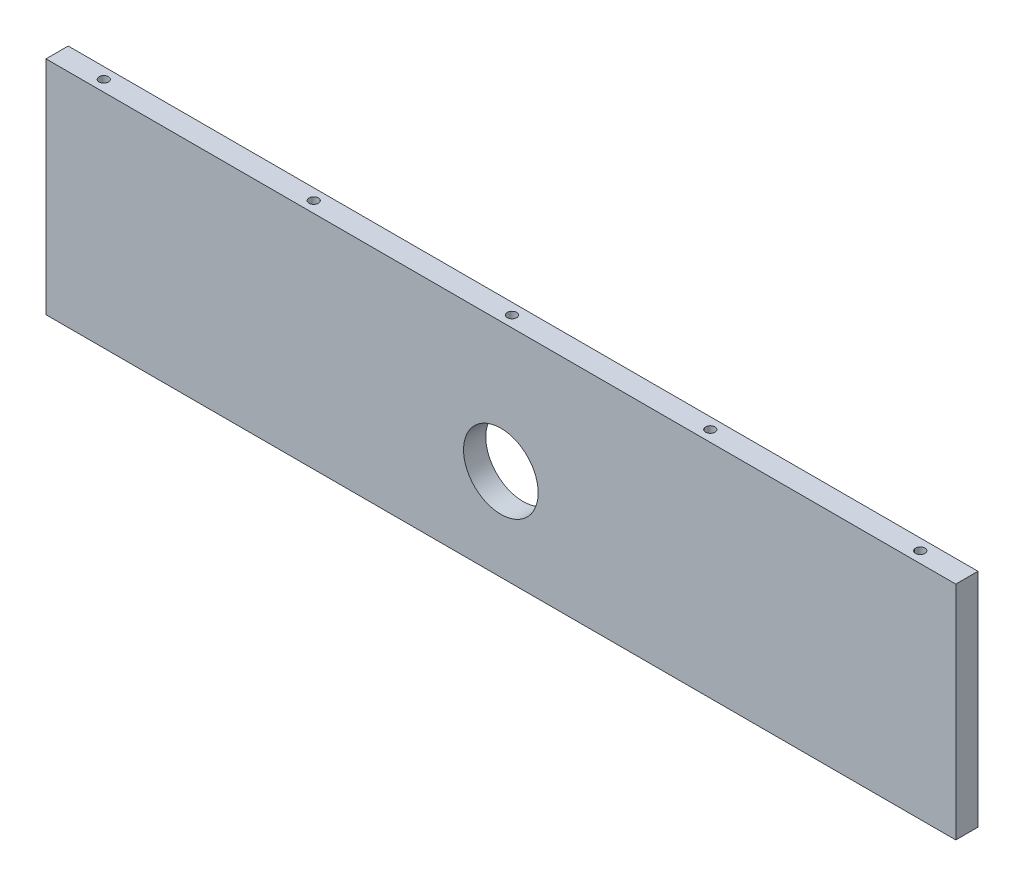
ISO-10303-21;
HEADER;
FILE_DESCRIPTION(('STEP AP214'),'2;1');
FILE_NAME('part.step','',(''),(''),'','','');
FILE_SCHEMA(('AUTOMOTIVE_DESIGN { 1 0 10303 214 1 1 1 1 }'));
ENDSEC;
DATA;
#1=APPLICATION_CONTEXT('core data for automotive mechanical design processes');
#2=APPLICATION_PROTOCOL_DEFINITION('international standard','automotive_design',2000,#1);
#3=PRODUCT_CONTEXT('',#1,'mechanical');
#4=PRODUCT('Part','Part','',(#3));
#5=PRODUCT_RELATED_PRODUCT_CATEGORY('part','',(#4));
#6=PRODUCT_DEFINITION_FORMATION('','',#4);
#7=PRODUCT_DEFINITION_CONTEXT('part definition',#1,'design');
#8=PRODUCT_DEFINITION('design','',#6,#7);
#9=PRODUCT_DEFINITION_SHAPE('','',#8);
#10=(LENGTH_UNIT() NAMED_UNIT(*) SI_UNIT(.MILLI.,.METRE.));
#11=(NAMED_UNIT(*) PLANE_ANGLE_UNIT() SI_UNIT($,.RADIAN.));
#12=(NAMED_UNIT(*) SI_UNIT($,.STERADIAN.) SOLID_ANGLE_UNIT());
#13=UNCERTAINTY_MEASURE_WITH_UNIT(LENGTH_MEASURE(1.E-05),#10,'distance_accuracy_value','');
#14=(GEOMETRIC_REPRESENTATION_CONTEXT(3) GLOBAL_UNCERTAINTY_ASSIGNED_CONTEXT((#13)) GLOBAL_UNIT_ASSIGNED_CONTEXT((#10,
#11,#12)) REPRESENTATION_CONTEXT('',''));
#15=CARTESIAN_POINT('',(0.,0.,0.));
#16=DIRECTION('',(0.,0.,1.));
#17=DIRECTION('',(1.,0.,0.));
#18=AXIS2_PLACEMENT_3D('',#15,#16,#17);
#19=CARTESIAN_POINT('',(-195.,47.5,9.525));
#20=DIRECTION('',(1.,0.,0.));
#21=DIRECTION('',(0.,0.,-1.));
#22=AXIS2_PLACEMENT_3D('',#19,#20,#21);
#23=PLANE('',#22);
#24=DIRECTION('',(0.,-1.,0.));
#25=VECTOR('',#24,1.);
#26=CARTESIAN_POINT('',(-195.,47.5,0.));
#27=LINE('',#26,#25);
#28=CARTESIAN_POINT('',(-195.,47.5,0.));
#29=VERTEX_POINT('',#28);
#30=CARTESIAN_POINT('',(-195.,-47.5,0.));
#31=VERTEX_POINT('',#30);
#32=EDGE_CURVE('E94',#29,#31,#27,.T.);
#33=ORIENTED_EDGE('',*,*,#32,.T.);
#34=DIRECTION('',(0.,0.,-1.));
#35=VECTOR('',#34,1.);
#36=CARTESIAN_POINT('',(-195.,-47.5,9.525));
#37=LINE('',#36,#35);
#38=CARTESIAN_POINT('',(-195.,-47.5,9.525));
#39=VERTEX_POINT('',#38);
#40=EDGE_CURVE('E11',#39,#31,#37,.T.);
#41=ORIENTED_EDGE('',*,*,#40,.F.);
#42=DIRECTION('',(0.,-1.,0.));
#43=VECTOR('',#42,1.);
#44=CARTESIAN_POINT('',(-195.,47.5,9.525));
#45=LINE('',#44,#43);
#46=CARTESIAN_POINT('',(-195.,47.5,9.525));
#47=VERTEX_POINT('',#46);
#48=EDGE_CURVE('E82',#47,#39,#45,.T.);
#49=ORIENTED_EDGE('',*,*,#48,.F.);
#50=DIRECTION('',(0.,0.,-1.));
#51=VECTOR('',#50,1.);
#52=CARTESIAN_POINT('',(-195.,47.5,9.525));
#53=LINE('',#52,#51);
#54=EDGE_CURVE('E90',#47,#29,#53,.T.);
#55=ORIENTED_EDGE('',*,*,#54,.T.);
#56=EDGE_LOOP('',(#33,#41,#49,#55));
#57=FACE_BOUND('',#56,.T.);
#58=ADVANCED_FACE('F31',(#57),#23,.F.);
#59=CARTESIAN_POINT('',(-195.,-47.5,9.525));
#60=DIRECTION('',(0.,1.,0.));
#61=DIRECTION('',(0.,0.,1.));
#62=AXIS2_PLACEMENT_3D('',#59,#60,#61);
#63=PLANE('',#62);
#64=CARTESIAN_POINT('',(115.,-47.5,4.7625));
#65=DIRECTION('',(0.,-1.,0.));
#66=DIRECTION('',(0.,0.,-1.));
#67=AXIS2_PLACEMENT_3D('',#64,#65,#66);
#68=CIRCLE('',#67,2.);
#69=CARTESIAN_POINT('',(115.,-47.5,2.7625));
#70=VERTEX_POINT('',#69);
#71=EDGE_CURVE('E156',#70,#70,#68,.T.);
#72=ORIENTED_EDGE('',*,*,#71,.F.);
#73=EDGE_LOOP('',(#72));
#74=FACE_BOUND('',#73,.T.);
#75=CARTESIAN_POINT('',(-115.,-47.5,4.7625));
#76=DIRECTION('',(0.,-1.,0.));
#77=DIRECTION('',(0.,0.,-1.));
#78=AXIS2_PLACEMENT_3D('',#75,#76,#77);
#79=CIRCLE('',#78,2.);
#80=CARTESIAN_POINT('',(-115.,-47.5,2.7625));
#81=VERTEX_POINT('',#80);
#82=EDGE_CURVE('E150',#81,#81,#79,.T.);
#83=ORIENTED_EDGE('',*,*,#82,.F.);
#84=EDGE_LOOP('',(#83));
#85=FACE_BOUND('',#84,.T.);
#86=CARTESIAN_POINT('',(0.,-47.5,4.7625));
#87=DIRECTION('',(0.,-1.,0.));
#88=DIRECTION('',(0.,0.,-1.));
#89=AXIS2_PLACEMENT_3D('',#86,#87,#88);
#90=CIRCLE('',#89,2.);
#91=CARTESIAN_POINT('',(0.,-47.5,2.7625));
#92=VERTEX_POINT('',#91);
#93=EDGE_CURVE('E144',#92,#92,#90,.T.);
#94=ORIENTED_EDGE('',*,*,#93,.F.);
#95=EDGE_LOOP('',(#94));
#96=FACE_BOUND('',#95,.T.);
#97=DIRECTION('',(1.,0.,0.));
#98=VECTOR('',#97,1.);
#99=CARTESIAN_POINT('',(-195.,-47.5,0.));
#100=LINE('',#99,#98);
#101=CARTESIAN_POINT('',(195.,-47.5,0.));
#102=VERTEX_POINT('',#101);
#103=EDGE_CURVE('E86',#31,#102,#100,.T.);
#104=ORIENTED_EDGE('',*,*,#103,.T.);
#105=DIRECTION('',(0.,0.,-1.));
#106=VECTOR('',#105,1.);
#107=CARTESIAN_POINT('',(195.,-47.5,9.525));
#108=LINE('',#107,#106);
#109=CARTESIAN_POINT('',(195.,-47.5,9.525));
#110=VERTEX_POINT('',#109);
#111=EDGE_CURVE('E39',#110,#102,#108,.T.);
#112=ORIENTED_EDGE('',*,*,#111,.F.);
#113=DIRECTION('',(1.,0.,0.));
#114=VECTOR('',#113,1.);
#115=CARTESIAN_POINT('',(-195.,-47.5,9.525));
#116=LINE('',#115,#114);
#117=EDGE_CURVE('E77',#39,#110,#116,.T.);
#118=ORIENTED_EDGE('',*,*,#117,.F.);
#119=ORIENTED_EDGE('',*,*,#40,.T.);
#120=EDGE_LOOP('',(#104,#112,#118,#119));
#121=FACE_BOUND('',#120,.T.);
#122=ADVANCED_FACE('F85',(#74,#85,#96,#121),#63,.F.);
#123=CARTESIAN_POINT('',(195.,47.5,9.525));
#124=DIRECTION('',(-1.,0.,0.));
#125=DIRECTION('',(0.,0.,1.));
#126=AXIS2_PLACEMENT_3D('',#123,#124,#125);
#127=PLANE('',#126);
#128=DIRECTION('',(0.,1.,0.));
#129=VECTOR('',#128,1.);
#130=CARTESIAN_POINT('',(195.,47.5,0.));
#131=LINE('',#130,#129);
#132=CARTESIAN_POINT('',(195.,47.5,0.));
#133=VERTEX_POINT('',#132);
#134=EDGE_CURVE('E64',#102,#133,#131,.T.);
#135=ORIENTED_EDGE('',*,*,#134,.T.);
#136=DIRECTION('',(0.,0.,-1.));
#137=VECTOR('',#136,1.);
#138=CARTESIAN_POINT('',(195.,47.5,9.525));
#139=LINE('',#138,#137);
#140=CARTESIAN_POINT('',(195.,47.5,9.525));
#141=VERTEX_POINT('',#140);
#142=EDGE_CURVE('E87',#141,#133,#139,.T.);
#143=ORIENTED_EDGE('',*,*,#142,.F.);
#144=DIRECTION('',(0.,1.,0.));
#145=VECTOR('',#144,1.);
#146=CARTESIAN_POINT('',(195.,47.5,9.525));
#147=LINE('',#146,#145);
#148=EDGE_CURVE('E80',#110,#141,#147,.T.);
#149=ORIENTED_EDGE('',*,*,#148,.F.);
#150=ORIENTED_EDGE('',*,*,#111,.T.);
#151=EDGE_LOOP('',(#135,#143,#149,#150));
#152=FACE_BOUND('',#151,.T.);
#153=ADVANCED_FACE('F88',(#152),#127,.F.);
#154=CARTESIAN_POINT('',(-195.,47.5,9.525));
#155=DIRECTION('',(0.,-1.,0.));
#156=DIRECTION('',(0.,0.,-1.));
#157=AXIS2_PLACEMENT_3D('',#154,#155,#156);
#158=PLANE('',#157);
#159=CARTESIAN_POINT('',(-85.,47.5,4.76250000000004));
#160=DIRECTION('',(0.,1.,0.));
#161=DIRECTION('',(0.,0.,-1.));
#162=AXIS2_PLACEMENT_3D('',#159,#160,#161);
#163=CIRCLE('',#162,2.);
#164=CARTESIAN_POINT('',(-85.,47.5,2.76250000000005));
#165=VERTEX_POINT('',#164);
#166=EDGE_CURVE('E138',#165,#165,#163,.T.);
#167=ORIENTED_EDGE('',*,*,#166,.F.);
#168=EDGE_LOOP('',(#167));
#169=FACE_BOUND('',#168,.T.);
#170=CARTESIAN_POINT('',(-175.,47.5,4.76250000000004));
#171=DIRECTION('',(0.,1.,0.));
#172=DIRECTION('',(0.,0.,-1.));
#173=AXIS2_PLACEMENT_3D('',#170,#171,#172);
#174=CIRCLE('',#173,2.);
#175=CARTESIAN_POINT('',(-175.,47.5,2.76250000000005));
#176=VERTEX_POINT('',#175);
#177=EDGE_CURVE('E132',#176,#176,#174,.T.);
#178=ORIENTED_EDGE('',*,*,#177,.F.);
#179=EDGE_LOOP('',(#178));
#180=FACE_BOUND('',#179,.T.);
#181=CARTESIAN_POINT('',(0.,47.5,4.7625));
#182=DIRECTION('',(0.,1.,0.));
#183=DIRECTION('',(0.,0.,1.));
#184=AXIS2_PLACEMENT_3D('',#181,#182,#183);
#185=CIRCLE('',#184,2.);
#186=CARTESIAN_POINT('',(0.,47.5,6.7625));
#187=VERTEX_POINT('',#186);
#188=EDGE_CURVE('E126',#187,#187,#185,.T.);
#189=ORIENTED_EDGE('',*,*,#188,.F.);
#190=EDGE_LOOP('',(#189));
#191=FACE_BOUND('',#190,.T.);
#192=CARTESIAN_POINT('',(85.,47.5,4.76250000000005));
#193=DIRECTION('',(0.,1.,0.));
#194=DIRECTION('',(0.,0.,1.));
#195=AXIS2_PLACEMENT_3D('',#192,#193,#194);
#196=CIRCLE('',#195,2.);
#197=CARTESIAN_POINT('',(85.,47.5,6.76250000000004));
#198=VERTEX_POINT('',#197);
#199=EDGE_CURVE('E120',#198,#198,#196,.T.);
#200=ORIENTED_EDGE('',*,*,#199,.F.);
#201=EDGE_LOOP('',(#200));
#202=FACE_BOUND('',#201,.T.);
#203=CARTESIAN_POINT('',(175.,47.5,4.76250000000005));
#204=DIRECTION('',(0.,1.,0.));
#205=DIRECTION('',(0.,0.,1.));
#206=AXIS2_PLACEMENT_3D('',#203,#204,#205);
#207=CIRCLE('',#206,2.);
#208=CARTESIAN_POINT('',(175.,47.5,6.76250000000004));
#209=VERTEX_POINT('',#208);
#210=EDGE_CURVE('E114',#209,#209,#207,.T.);
#211=ORIENTED_EDGE('',*,*,#210,.F.);
#212=EDGE_LOOP('',(#211));
#213=FACE_BOUND('',#212,.T.);
#214=DIRECTION('',(-1.,0.,0.));
#215=VECTOR('',#214,1.);
#216=CARTESIAN_POINT('',(-195.,47.5,0.));
#217=LINE('',#216,#215);
#218=EDGE_CURVE('E70',#133,#29,#217,.T.);
#219=ORIENTED_EDGE('',*,*,#218,.T.);
#220=ORIENTED_EDGE('',*,*,#54,.F.);
#221=DIRECTION('',(-1.,0.,0.));
#222=VECTOR('',#221,1.);
#223=CARTESIAN_POINT('',(-195.,47.5,9.525));
#224=LINE('',#223,#222);
#225=EDGE_CURVE('E47',#141,#47,#224,.T.);
#226=ORIENTED_EDGE('',*,*,#225,.F.);
#227=ORIENTED_EDGE('',*,*,#142,.T.);
#228=EDGE_LOOP('',(#219,#220,#226,#227));
#229=FACE_BOUND('',#228,.T.);
#230=ADVANCED_FACE('F102',(#169,#180,#191,#202,#213,#229),#158,.F.);
#231=CARTESIAN_POINT('',(-195.,-47.5,9.525));
#232=DIRECTION('',(0.,0.,1.));
#233=DIRECTION('',(1.,0.,0.));
#234=AXIS2_PLACEMENT_3D('',#231,#232,#233);
#235=PLANE('',#234);
#236=CARTESIAN_POINT('',(-0.0119710385839134,-8.11999999999998,9.525));
#237=DIRECTION('',(0.,0.,1.));
#238=DIRECTION('',(1.,0.,0.));
#239=AXIS2_PLACEMENT_3D('',#236,#237,#238);
#240=CIRCLE('',#239,16.);
#241=CARTESIAN_POINT('',(15.9880289614161,-8.11999999999998,9.525));
#242=VERTEX_POINT('',#241);
#243=EDGE_CURVE('E110',#242,#242,#240,.T.);
#244=ORIENTED_EDGE('',*,*,#243,.F.);
#245=EDGE_LOOP('',(#244));
#246=FACE_BOUND('',#245,.T.);
#247=ORIENTED_EDGE('',*,*,#48,.T.);
#248=ORIENTED_EDGE('',*,*,#117,.T.);
#249=ORIENTED_EDGE('',*,*,#148,.T.);
#250=ORIENTED_EDGE('',*,*,#225,.T.);
#251=EDGE_LOOP('',(#247,#248,#249,#250));
#252=FACE_BOUND('',#251,.T.);
#253=ADVANCED_FACE('F78',(#246,#252),#235,.T.);
#254=CARTESIAN_POINT('',(-195.,-47.5,0.));
#255=DIRECTION('',(0.,0.,1.));
#256=DIRECTION('',(1.,0.,0.));
#257=AXIS2_PLACEMENT_3D('',#254,#255,#256);
#258=PLANE('',#257);
#259=CARTESIAN_POINT('',(-0.0119710385839134,-8.11999999999998,0.));
#260=DIRECTION('',(0.,0.,1.));
#261=DIRECTION('',(1.,0.,0.));
#262=AXIS2_PLACEMENT_3D('',#259,#260,#261);
#263=CIRCLE('',#262,16.);
#264=CARTESIAN_POINT('',(15.9880289614161,-8.11999999999998,0.));
#265=VERTEX_POINT('',#264);
#266=EDGE_CURVE('E97',#265,#265,#263,.F.);
#267=ORIENTED_EDGE('',*,*,#266,.F.);
#268=EDGE_LOOP('',(#267));
#269=FACE_BOUND('',#268,.T.);
#270=ORIENTED_EDGE('',*,*,#32,.F.);
#271=ORIENTED_EDGE('',*,*,#218,.F.);
#272=ORIENTED_EDGE('',*,*,#134,.F.);
#273=ORIENTED_EDGE('',*,*,#103,.F.);
#274=EDGE_LOOP('',(#270,#271,#272,#273));
#275=FACE_BOUND('',#274,.T.);
#276=ADVANCED_FACE('F105',(#269,#275),#258,.F.);
#277=CARTESIAN_POINT('',(-0.0119710385839134,-8.11999999999998,-45.254833995939));
#278=DIRECTION('',(0.,0.,1.));
#279=DIRECTION('',(1.,0.,0.));
#280=AXIS2_PLACEMENT_3D('',#277,#278,#279);
#281=CYLINDRICAL_SURFACE('',#280,16.);
#282=ORIENTED_EDGE('',*,*,#266,.T.);
#283=EDGE_LOOP('',(#282));
#284=FACE_BOUND('',#283,.T.);
#285=ORIENTED_EDGE('',*,*,#243,.T.);
#286=EDGE_LOOP('',(#285));
#287=FACE_BOUND('',#286,.T.);
#288=ADVANCED_FACE('F230',(#284,#287),#281,.F.);
#289=CARTESIAN_POINT('',(175.,27.5,4.76250000000005));
#290=DIRECTION('',(0.,1.,0.));
#291=DIRECTION('',(0.,0.,1.));
#292=AXIS2_PLACEMENT_3D('',#289,#290,#291);
#293=CYLINDRICAL_SURFACE('',#292,2.);
#294=CARTESIAN_POINT('',(175.,27.5,4.76250000000005));
#295=DIRECTION('',(0.,1.,0.));
#296=DIRECTION('',(0.,0.,1.));
#297=AXIS2_PLACEMENT_3D('',#294,#295,#296);
#298=CIRCLE('',#297,2.);
#299=CARTESIAN_POINT('',(175.,27.5,6.76250000000004));
#300=VERTEX_POINT('',#299);
#301=EDGE_CURVE('E113',#300,#300,#298,.T.);
#302=ORIENTED_EDGE('',*,*,#301,.F.);
#303=EDGE_LOOP('',(#302));
#304=FACE_BOUND('',#303,.T.);
#305=ORIENTED_EDGE('',*,*,#210,.T.);
#306=EDGE_LOOP('',(#305));
#307=FACE_BOUND('',#306,.T.);
#308=ADVANCED_FACE('F237',(#304,#307),#293,.F.);
#309=CARTESIAN_POINT('',(175.,27.5,4.76250000000005));
#310=DIRECTION('',(0.,1.,0.));
#311=DIRECTION('',(0.,0.,1.));
#312=AXIS2_PLACEMENT_3D('',#309,#310,#311);
#313=PLANE('',#312);
#314=ORIENTED_EDGE('',*,*,#301,.T.);
#315=EDGE_LOOP('',(#314));
#316=FACE_BOUND('',#315,.T.);
#317=ADVANCED_FACE('F244',(#316),#313,.T.);
#318=CARTESIAN_POINT('',(85.,27.5,4.76250000000005));
#319=DIRECTION('',(0.,1.,0.));
#320=DIRECTION('',(0.,0.,1.));
#321=AXIS2_PLACEMENT_3D('',#318,#319,#320);
#322=CYLINDRICAL_SURFACE('',#321,2.);
#323=CARTESIAN_POINT('',(85.,27.5,4.76250000000005));
#324=DIRECTION('',(0.,1.,0.));
#325=DIRECTION('',(0.,0.,1.));
#326=AXIS2_PLACEMENT_3D('',#323,#324,#325);
#327=CIRCLE('',#326,2.);
#328=CARTESIAN_POINT('',(85.,27.5,6.76250000000004));
#329=VERTEX_POINT('',#328);
#330=EDGE_CURVE('E117',#329,#329,#327,.T.);
#331=ORIENTED_EDGE('',*,*,#330,.F.);
#332=EDGE_LOOP('',(#331));
#333=FACE_BOUND('',#332,.T.);
#334=ORIENTED_EDGE('',*,*,#199,.T.);
#335=EDGE_LOOP('',(#334));
#336=FACE_BOUND('',#335,.T.);
#337=ADVANCED_FACE('F252',(#333,#336),#322,.F.);
#338=CARTESIAN_POINT('',(85.,27.5,4.76250000000005));
#339=DIRECTION('',(0.,1.,0.));
#340=DIRECTION('',(0.,0.,1.));
#341=AXIS2_PLACEMENT_3D('',#338,#339,#340);
#342=PLANE('',#341);
#343=ORIENTED_EDGE('',*,*,#330,.T.);
#344=EDGE_LOOP('',(#343));
#345=FACE_BOUND('',#344,.T.);
#346=ADVANCED_FACE('F260',(#345),#342,.T.);
#347=CARTESIAN_POINT('',(0.,27.5,4.7625));
#348=DIRECTION('',(0.,1.,0.));
#349=DIRECTION('',(0.,0.,1.));
#350=AXIS2_PLACEMENT_3D('',#347,#348,#349);
#351=CYLINDRICAL_SURFACE('',#350,2.);
#352=CARTESIAN_POINT('',(0.,27.5,4.7625));
#353=DIRECTION('',(0.,1.,0.));
#354=DIRECTION('',(0.,0.,1.));
#355=AXIS2_PLACEMENT_3D('',#352,#353,#354);
#356=CIRCLE('',#355,2.);
#357=CARTESIAN_POINT('',(0.,27.5,6.7625));
#358=VERTEX_POINT('',#357);
#359=EDGE_CURVE('E123',#358,#358,#356,.T.);
#360=ORIENTED_EDGE('',*,*,#359,.F.);
#361=EDGE_LOOP('',(#360));
#362=FACE_BOUND('',#361,.T.);
#363=ORIENTED_EDGE('',*,*,#188,.T.);
#364=EDGE_LOOP('',(#363));
#365=FACE_BOUND('',#364,.T.);
#366=ADVANCED_FACE('F268',(#362,#365),#351,.F.);
#367=CARTESIAN_POINT('',(0.,27.5,4.7625));
#368=DIRECTION('',(0.,1.,0.));
#369=DIRECTION('',(0.,0.,1.));
#370=AXIS2_PLACEMENT_3D('',#367,#368,#369);
#371=PLANE('',#370);
#372=ORIENTED_EDGE('',*,*,#359,.T.);
#373=EDGE_LOOP('',(#372));
#374=FACE_BOUND('',#373,.T.);
#375=ADVANCED_FACE('F276',(#374),#371,.T.);
#376=CARTESIAN_POINT('',(-175.,27.5,4.76250000000004));
#377=DIRECTION('',(0.,1.,0.));
#378=DIRECTION('',(0.,0.,1.));
#379=AXIS2_PLACEMENT_3D('',#376,#377,#378);
#380=CYLINDRICAL_SURFACE('',#379,2.);
#381=CARTESIAN_POINT('',(-175.,27.5,4.76250000000004));
#382=DIRECTION('',(0.,1.,0.));
#383=DIRECTION('',(0.,0.,-1.));
#384=AXIS2_PLACEMENT_3D('',#381,#382,#383);
#385=CIRCLE('',#384,2.);
#386=CARTESIAN_POINT('',(-175.,27.5,2.76250000000005));
#387=VERTEX_POINT('',#386);
#388=EDGE_CURVE('E129',#387,#387,#385,.T.);
#389=ORIENTED_EDGE('',*,*,#388,.F.);
#390=EDGE_LOOP('',(#389));
#391=FACE_BOUND('',#390,.T.);
#392=ORIENTED_EDGE('',*,*,#177,.T.);
#393=EDGE_LOOP('',(#392));
#394=FACE_BOUND('',#393,.T.);
#395=ADVANCED_FACE('F284',(#391,#394),#380,.F.);
#396=CARTESIAN_POINT('',(-175.,27.5,4.76250000000004));
#397=DIRECTION('',(0.,-1.,0.));
#398=DIRECTION('',(0.,0.,-1.));
#399=AXIS2_PLACEMENT_3D('',#396,#397,#398);
#400=PLANE('',#399);
#401=ORIENTED_EDGE('',*,*,#388,.T.);
#402=EDGE_LOOP('',(#401));
#403=FACE_BOUND('',#402,.T.);
#404=ADVANCED_FACE('F292',(#403),#400,.F.);
#405=CARTESIAN_POINT('',(-85.,27.5,4.76250000000004));
#406=DIRECTION('',(0.,1.,0.));
#407=DIRECTION('',(0.,0.,1.));
#408=AXIS2_PLACEMENT_3D('',#405,#406,#407);
#409=CYLINDRICAL_SURFACE('',#408,2.);
#410=CARTESIAN_POINT('',(-85.,27.5,4.76250000000004));
#411=DIRECTION('',(0.,1.,0.));
#412=DIRECTION('',(0.,0.,-1.));
#413=AXIS2_PLACEMENT_3D('',#410,#411,#412);
#414=CIRCLE('',#413,2.);
#415=CARTESIAN_POINT('',(-85.,27.5,2.76250000000005));
#416=VERTEX_POINT('',#415);
#417=EDGE_CURVE('E135',#416,#416,#414,.T.);
#418=ORIENTED_EDGE('',*,*,#417,.F.);
#419=EDGE_LOOP('',(#418));
#420=FACE_BOUND('',#419,.T.);
#421=ORIENTED_EDGE('',*,*,#166,.T.);
#422=EDGE_LOOP('',(#421));
#423=FACE_BOUND('',#422,.T.);
#424=ADVANCED_FACE('F190',(#420,#423),#409,.F.);
#425=CARTESIAN_POINT('',(-85.,27.5,4.76250000000004));
#426=DIRECTION('',(0.,-1.,0.));
#427=DIRECTION('',(0.,0.,-1.));
#428=AXIS2_PLACEMENT_3D('',#425,#426,#427);
#429=PLANE('',#428);
#430=ORIENTED_EDGE('',*,*,#417,.T.);
#431=EDGE_LOOP('',(#430));
#432=FACE_BOUND('',#431,.T.);
#433=ADVANCED_FACE('F180',(#432),#429,.F.);
#434=CARTESIAN_POINT('',(0.,-27.5,4.7625));
#435=DIRECTION('',(0.,-1.,0.));
#436=DIRECTION('',(0.,0.,-1.));
#437=AXIS2_PLACEMENT_3D('',#434,#435,#436);
#438=CYLINDRICAL_SURFACE('',#437,2.);
#439=CARTESIAN_POINT('',(0.,-27.5,4.7625));
#440=DIRECTION('',(0.,-1.,0.));
#441=DIRECTION('',(0.,0.,-1.));
#442=AXIS2_PLACEMENT_3D('',#439,#440,#441);
#443=CIRCLE('',#442,2.);
#444=CARTESIAN_POINT('',(0.,-27.5,2.7625));
#445=VERTEX_POINT('',#444);
#446=EDGE_CURVE('E141',#445,#445,#443,.T.);
#447=ORIENTED_EDGE('',*,*,#446,.F.);
#448=EDGE_LOOP('',(#447));
#449=FACE_BOUND('',#448,.T.);
#450=ORIENTED_EDGE('',*,*,#93,.T.);
#451=EDGE_LOOP('',(#450));
#452=FACE_BOUND('',#451,.T.);
#453=ADVANCED_FACE('F177',(#449,#452),#438,.F.);
#454=CARTESIAN_POINT('',(0.,-27.5,4.7625));
#455=DIRECTION('',(0.,-1.,0.));
#456=DIRECTION('',(0.,0.,-1.));
#457=AXIS2_PLACEMENT_3D('',#454,#455,#456);
#458=PLANE('',#457);
#459=ORIENTED_EDGE('',*,*,#446,.T.);
#460=EDGE_LOOP('',(#459));
#461=FACE_BOUND('',#460,.T.);
#462=ADVANCED_FACE('F179',(#461),#458,.T.);
#463=CARTESIAN_POINT('',(-115.,-27.5,4.7625));
#464=DIRECTION('',(0.,-1.,0.));
#465=DIRECTION('',(0.,0.,-1.));
#466=AXIS2_PLACEMENT_3D('',#463,#464,#465);
#467=CYLINDRICAL_SURFACE('',#466,2.);
#468=CARTESIAN_POINT('',(-115.,-27.5,4.7625));
#469=DIRECTION('',(0.,-1.,0.));
#470=DIRECTION('',(0.,0.,-1.));
#471=AXIS2_PLACEMENT_3D('',#468,#469,#470);
#472=CIRCLE('',#471,2.);
#473=CARTESIAN_POINT('',(-115.,-27.5,2.7625));
#474=VERTEX_POINT('',#473);
#475=EDGE_CURVE('E147',#474,#474,#472,.T.);
#476=ORIENTED_EDGE('',*,*,#475,.F.);
#477=EDGE_LOOP('',(#476));
#478=FACE_BOUND('',#477,.T.);
#479=ORIENTED_EDGE('',*,*,#82,.T.);
#480=EDGE_LOOP('',(#479));
#481=FACE_BOUND('',#480,.T.);
#482=ADVANCED_FACE('F187',(#478,#481),#467,.F.);
#483=CARTESIAN_POINT('',(-115.,-27.5,4.7625));
#484=DIRECTION('',(0.,-1.,0.));
#485=DIRECTION('',(0.,0.,-1.));
#486=AXIS2_PLACEMENT_3D('',#483,#484,#485);
#487=PLANE('',#486);
#488=ORIENTED_EDGE('',*,*,#475,.T.);
#489=EDGE_LOOP('',(#488));
#490=FACE_BOUND('',#489,.T.);
#491=ADVANCED_FACE('F167',(#490),#487,.T.);
#492=CARTESIAN_POINT('',(115.,-27.5,4.7625));
#493=DIRECTION('',(0.,-1.,0.));
#494=DIRECTION('',(0.,0.,-1.));
#495=AXIS2_PLACEMENT_3D('',#492,#493,#494);
#496=CYLINDRICAL_SURFACE('',#495,2.);
#497=CARTESIAN_POINT('',(115.,-27.5,4.7625));
#498=DIRECTION('',(0.,-1.,0.));
#499=DIRECTION('',(0.,0.,-1.));
#500=AXIS2_PLACEMENT_3D('',#497,#498,#499);
#501=CIRCLE('',#500,2.);
#502=CARTESIAN_POINT('',(115.,-27.5,2.7625));
#503=VERTEX_POINT('',#502);
#504=EDGE_CURVE('E153',#503,#503,#501,.T.);
#505=ORIENTED_EDGE('',*,*,#504,.F.);
#506=EDGE_LOOP('',(#505));
#507=FACE_BOUND('',#506,.T.);
#508=ORIENTED_EDGE('',*,*,#71,.T.);
#509=EDGE_LOOP('',(#508));
#510=FACE_BOUND('',#509,.T.);
#511=ADVANCED_FACE('F164',(#507,#510),#496,.F.);
#512=CARTESIAN_POINT('',(115.,-27.5,4.7625));
#513=DIRECTION('',(0.,-1.,0.));
#514=DIRECTION('',(0.,0.,-1.));
#515=AXIS2_PLACEMENT_3D('',#512,#513,#514);
#516=PLANE('',#515);
#517=ORIENTED_EDGE('',*,*,#504,.T.);
#518=EDGE_LOOP('',(#517));
#519=FACE_BOUND('',#518,.T.);
#520=ADVANCED_FACE('F162',(#519),#516,.T.);
#521=CLOSED_SHELL('',(#58,#122,#153,#230,#253,#276,#288,#308,#317,#337,#346,#366,#375,#395,#404,
#424,#433,#453,#462,#482,#491,#511,#520));
#522=MANIFOLD_SOLID_BREP('B2',#521);
#523=ADVANCED_BREP_SHAPE_REPRESENTATION('',(#18,#522),#14);
#524=SHAPE_DEFINITION_REPRESENTATION(#9,#523);
ENDSEC;
END-ISO-10303-21;
